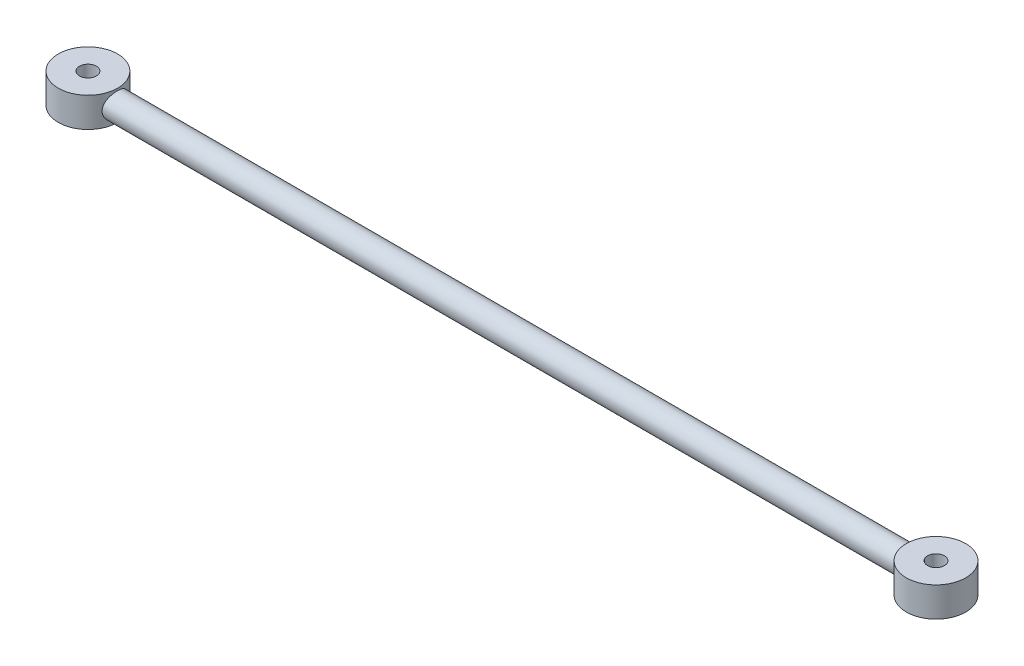
ISO-10303-21;
HEADER;
FILE_DESCRIPTION(('STEP AP214'),'2;1');
FILE_NAME('part.step','',(''),(''),'','','');
FILE_SCHEMA(('AUTOMOTIVE_DESIGN { 1 0 10303 214 1 1 1 1 }'));
ENDSEC;
DATA;
#1=APPLICATION_CONTEXT('core data for automotive mechanical design processes');
#2=APPLICATION_PROTOCOL_DEFINITION('international standard','automotive_design',2000,#1);
#3=PRODUCT_CONTEXT('',#1,'mechanical');
#4=PRODUCT('Part','Part','',(#3));
#5=PRODUCT_RELATED_PRODUCT_CATEGORY('part','',(#4));
#6=PRODUCT_DEFINITION_FORMATION('','',#4);
#7=PRODUCT_DEFINITION_CONTEXT('part definition',#1,'design');
#8=PRODUCT_DEFINITION('design','',#6,#7);
#9=PRODUCT_DEFINITION_SHAPE('','',#8);
#10=(LENGTH_UNIT() NAMED_UNIT(*) SI_UNIT(.MILLI.,.METRE.));
#11=(NAMED_UNIT(*) PLANE_ANGLE_UNIT() SI_UNIT($,.RADIAN.));
#12=(NAMED_UNIT(*) SI_UNIT($,.STERADIAN.) SOLID_ANGLE_UNIT());
#13=UNCERTAINTY_MEASURE_WITH_UNIT(LENGTH_MEASURE(1.E-05),#10,'distance_accuracy_value','');
#14=(GEOMETRIC_REPRESENTATION_CONTEXT(3) GLOBAL_UNCERTAINTY_ASSIGNED_CONTEXT((#13)) GLOBAL_UNIT_ASSIGNED_CONTEXT((#10,
#11,#12)) REPRESENTATION_CONTEXT('',''));
#15=CARTESIAN_POINT('',(0.,0.,0.));
#16=DIRECTION('',(0.,0.,1.));
#17=DIRECTION('',(1.,0.,0.));
#18=AXIS2_PLACEMENT_3D('',#15,#16,#17);
#19=CARTESIAN_POINT('',(0.,7.,0.));
#20=DIRECTION('',(0.,-1.,0.));
#21=DIRECTION('',(0.,0.,-1.));
#22=AXIS2_PLACEMENT_3D('',#19,#20,#21);
#23=CYLINDRICAL_SURFACE('',#22,7.);
#24=CARTESIAN_POINT('',(0.,7.,0.));
#25=DIRECTION('',(0.,1.,0.));
#26=DIRECTION('',(0.,0.,1.));
#27=AXIS2_PLACEMENT_3D('',#24,#25,#26);
#28=CIRCLE('',#27,7.);
#29=CARTESIAN_POINT('',(0.,7.,7.));
#30=VERTEX_POINT('',#29);
#31=EDGE_CURVE('E42',#30,#30,#28,.T.);
#32=ORIENTED_EDGE('',*,*,#31,.F.);
#33=EDGE_LOOP('',(#32));
#34=FACE_BOUND('',#33,.T.);
#35=CARTESIAN_POINT('',(0.,0.,0.));
#36=DIRECTION('',(0.,1.,0.));
#37=DIRECTION('',(0.,0.,1.));
#38=AXIS2_PLACEMENT_3D('',#35,#36,#37);
#39=CIRCLE('',#38,7.);
#40=CARTESIAN_POINT('',(0.,0.,7.));
#41=VERTEX_POINT('',#40);
#42=EDGE_CURVE('E46',#41,#41,#39,.T.);
#43=ORIENTED_EDGE('',*,*,#42,.T.);
#44=EDGE_LOOP('',(#43));
#45=FACE_BOUND('',#44,.T.);
#46=CARTESIAN_POINT('',(6.32455532033676,3.5,3.));
#47=CARTESIAN_POINT('',(6.32455623917925,3.42019923696911,2.99999904512121));
#48=CARTESIAN_POINT('',(6.32607259589376,3.34036918002945,2.99680914186365));
#49=CARTESIAN_POINT('',(6.33207844610818,3.18131310904515,2.98409481890062));
#50=CARTESIAN_POINT('',(6.33656983318198,3.10208751223992,2.97456636476115));
#51=CARTESIAN_POINT('',(6.35433138320313,2.86591097345671,2.93654933365817));
#52=CARTESIAN_POINT('',(6.3718883479981,2.71068003414275,2.8986294210123));
#53=CARTESIAN_POINT('',(6.41604959211165,2.41012968440135,2.79949691759116));
#54=CARTESIAN_POINT('',(6.44261548670749,2.2647713124138,2.73838302089271));
#55=CARTESIAN_POINT('',(6.50173461776113,1.98637445600225,2.59488993442856));
#56=CARTESIAN_POINT('',(6.53428667863442,1.8533335603279,2.51251491871712));
#57=CARTESIAN_POINT('',(6.604111083221,1.59454716049575,2.32303426891366));
#58=CARTESIAN_POINT('',(6.64154929418065,1.46971373094871,2.21474428773221));
#59=CARTESIAN_POINT('',(6.71556787556132,1.23929814294093,1.9789916252315));
#60=CARTESIAN_POINT('',(6.75214789882674,1.13372366200242,1.85152133453084));
#61=CARTESIAN_POINT('',(6.82236442416004,0.940080759541392,1.5737748906695));
#62=CARTESIAN_POINT('',(6.85578586283844,0.853050747922684,1.42271545416052));
#63=CARTESIAN_POINT('',(6.91387422205065,0.706035833355378,1.10640716164424));
#64=CARTESIAN_POINT('',(6.93854524147057,0.646038264254936,0.941164994307303));
#65=CARTESIAN_POINT('',(6.97517471062289,0.558134963639046,0.610764262051987));
#66=CARTESIAN_POINT('',(6.98775448299434,0.5286539309609,0.446095117735235));
#67=CARTESIAN_POINT('',(7.00104925914407,0.497517303282849,0.113699399968668));
#68=CARTESIAN_POINT('',(7.00176937203861,0.495849726301001,-0.0540258257506384));
#69=CARTESIAN_POINT('',(6.99162033228837,0.519590247791058,-0.376268415183327));
#70=CARTESIAN_POINT('',(6.98149359551672,0.543263799683697,-0.530941438169347));
#71=CARTESIAN_POINT('',(6.95182205628876,0.614024068920169,-0.833871717827574));
#72=CARTESIAN_POINT('',(6.93227655784003,0.661112516498579,-0.982128499493937));
#73=CARTESIAN_POINT('',(6.88526693329208,0.77790658965267,-1.27075797068383));
#74=CARTESIAN_POINT('',(6.85768620781763,0.847947292329128,-1.41097529460904));
#75=CARTESIAN_POINT('',(6.79727675004241,1.0083173553763,-1.67803533028446));
#76=CARTESIAN_POINT('',(6.76444613359548,1.09865400454071,-1.8048732130277));
#77=CARTESIAN_POINT('',(6.69393790301249,1.30480950667601,-2.05154784007323));
#78=CARTESIAN_POINT('',(6.65608139107459,1.42201886977399,-2.1701729768624));
#79=CARTESIAN_POINT('',(6.58157631342609,1.67470283164954,-2.38662617777592));
#80=CARTESIAN_POINT('',(6.5449282748833,1.81018527380674,-2.48444526456874));
#81=CARTESIAN_POINT('',(6.47566835431168,2.10177987447147,-2.65987942757701));
#82=CARTESIAN_POINT('',(6.44325238173047,2.25846414548125,-2.73662769389096));
#83=CARTESIAN_POINT('',(6.3884939447888,2.58428900834334,-2.86214771894642));
#84=CARTESIAN_POINT('',(6.36614379619967,2.75341998325804,-2.9109408263676));
#85=CARTESIAN_POINT('',(6.33598550498636,3.08717279561205,-2.9759867011968));
#86=CARTESIAN_POINT('',(6.32729797712828,3.25132898060731,-2.99421280080632));
#87=CARTESIAN_POINT('',(6.32292988606605,3.58054897510828,-3.00343131976712));
#88=CARTESIAN_POINT('',(6.32724437007431,3.74561241510746,-2.99443410914468));
#89=CARTESIAN_POINT('',(6.34748143158175,4.05986257374344,-2.9512647841786));
#90=CARTESIAN_POINT('',(6.36257694871081,4.20935574037177,-2.9188846108295));
#91=CARTESIAN_POINT('',(6.40159573000742,4.50064547636968,-2.83228012727602));
#92=CARTESIAN_POINT('',(6.42552113853308,4.64244016654448,-2.77805051059372));
#93=CARTESIAN_POINT('',(6.48076667248579,4.92120989029112,-2.64668378105435));
#94=CARTESIAN_POINT('',(6.51236308247384,5.05770732182204,-2.5686531941561));
#95=CARTESIAN_POINT('',(6.57901833984006,5.31635070551129,-2.39277124314047));
#96=CARTESIAN_POINT('',(6.61407874120977,5.43849016219808,-2.29491096228641));
#97=CARTESIAN_POINT('',(6.68739396565838,5.6760289255727,-2.07211495440809));
#98=CARTESIAN_POINT('',(6.72566111015056,5.78991523722376,-1.94556360485738));
#99=CARTESIAN_POINT('',(6.79826947497518,5.9951342372748,-1.67428466903032));
#100=CARTESIAN_POINT('',(6.83261030191759,6.08646466679208,-1.5295552644811));
#101=CARTESIAN_POINT('',(6.89381439172467,6.24408268980707,-1.2245807874168));
#102=CARTESIAN_POINT('',(6.92064008929576,6.3102450462872,-1.06426298143306));
#103=CARTESIAN_POINT('',(6.96347660484597,6.41414979815623,-0.733319762769437));
#104=CARTESIAN_POINT('',(6.9794942735468,6.45191019800838,-0.562700954301774));
#105=CARTESIAN_POINT('',(6.99808081286415,6.49557746015662,-0.22948038459567));
#106=CARTESIAN_POINT('',(7.00154837158207,6.50361382051941,-0.0672060876467148));
#107=CARTESIAN_POINT('',(6.99717401704727,6.49340448125966,0.256339620951763));
#108=CARTESIAN_POINT('',(6.98933429595527,6.47516387599597,0.41761122090852));
#109=CARTESIAN_POINT('',(6.96371224258031,6.41444649582745,0.728044798339694));
#110=CARTESIAN_POINT('',(6.9463310265813,6.37294615263452,0.877433690400419));
#111=CARTESIAN_POINT('',(6.90358200259661,6.26798381608021,1.16704890744754));
#112=CARTESIAN_POINT('',(6.87821272472253,6.20451778058432,1.30727354037359));
#113=CARTESIAN_POINT('',(6.82048100144583,6.05421011216401,1.58164154030708));
#114=CARTESIAN_POINT('',(6.78785230171247,5.96643407814648,1.71521554911027));
#115=CARTESIAN_POINT('',(6.71941601876114,5.7713182864619,1.96631980223032));
#116=CARTESIAN_POINT('',(6.68360718068102,5.66397078827051,2.08384366642576));
#117=CARTESIAN_POINT('',(6.60956029826528,5.42361613655686,2.30839582375668));
#118=CARTESIAN_POINT('',(6.57133471854879,5.28931158538104,2.41404185093548));
#119=CARTESIAN_POINT('',(6.49938146624856,5.0036538672722,2.60157161791914));
#120=CARTESIAN_POINT('',(6.46565641748318,4.85229084924017,2.68344152863089));
#121=CARTESIAN_POINT('',(6.42172587804179,4.61561755892372,2.78618250414778));
#122=CARTESIAN_POINT('',(6.40819457191417,4.53514424084097,2.81707998873811));
#123=CARTESIAN_POINT('',(6.38380411418013,4.37148377716792,2.87192428390112));
#124=CARTESIAN_POINT('',(6.37294364206054,4.28829799580876,2.89587453038153));
#125=CARTESIAN_POINT('',(6.35433014729515,4.12006919231867,2.93649221837599));
#126=CARTESIAN_POINT('',(6.3465689441917,4.03503169261803,2.9531788427136));
#127=CARTESIAN_POINT('',(6.33442493706763,3.86363722828714,2.97913893233313));
#128=CARTESIAN_POINT('',(6.33003954418514,3.77728132665879,2.9884180785096));
#129=CARTESIAN_POINT('',(6.32647229512562,3.65893859982364,2.99595579124565));
#130=CARTESIAN_POINT('',(6.32575401974705,3.62717571924005,2.99747183035651));
#131=CARTESIAN_POINT('',(6.3247953454093,3.56361011083144,2.99949413311609));
#132=CARTESIAN_POINT('',(6.32455495409998,3.5318073823767,3.00000038060031));
#133=CARTESIAN_POINT('',(6.32455532033676,3.5,3.));
#134=B_SPLINE_CURVE_WITH_KNOTS('',3,(#46,#47,#48,#49,#50,#51,#52,#53,#54,#55,#56,#57,#58,#59,
#60,#61,#62,#63,#64,#65,#66,#67,#68,#69,#70,#71,#72,#73,#74,#75,#76,#77,#78,#79,#80,#81,#82,#83,
#84,#85,#86,#87,#88,#89,#90,#91,#92,#93,#94,#95,#96,#97,#98,#99,#100,#101,#102,#103,#104,#105,
#106,#107,#108,#109,#110,#111,#112,#113,#114,#115,#116,#117,#118,#119,#120,#121,#122,#123,#124,
#125,#126,#127,#128,#129,#130,#131,#132,#133),.UNSPECIFIED.,.T.,.F.,(4,2,2,2,2,2,2,2,2,2,2,2,2,
2,2,2,2,2,2,2,2,2,2,2,2,2,2,2,2,2,2,2,2,2,2,2,2,2,2,2,2,2,2,4),(0.,0.239366653231037,
0.478885807272612,0.958574399125933,1.43624431857918,1.91382053150697,2.41995684393642,
2.92629448725105,3.45610451675016,3.98566604296334,4.48627308722847,4.98666446539179,
5.45487182502104,5.92311378779298,6.39852111765622,6.8740994521391,7.38485137094338,
7.89582322238327,8.42542768080316,8.95462715213609,9.44812252419892,9.94142993544506,
10.4004743903489,10.8596303986217,11.3387499488479,11.8180854227975,12.3391595177845,
12.8602857751477,13.3839722669446,13.9073265049035,14.3923682623503,14.8773159966024,
15.3432850585276,15.8093399138768,16.2966585998759,16.784170440423,17.3070906286303,
17.8303143607246,18.0917878499581,18.3531318004373,18.6137813055803,18.8742307225593,
18.9696371385413,19.0650450817536),.UNSPECIFIED.);
#135=CARTESIAN_POINT('',(6.32455532033676,3.5,3.));
#136=VERTEX_POINT('',#135);
#137=EDGE_CURVE('E10',#136,#136,#134,.T.);
#138=ORIENTED_EDGE('',*,*,#137,.F.);
#139=EDGE_LOOP('',(#138));
#140=FACE_BOUND('',#139,.T.);
#141=ADVANCED_FACE('F31',(#34,#45,#140),#23,.T.);
#142=CARTESIAN_POINT('',(0.,7.,0.));
#143=DIRECTION('',(0.,1.,0.));
#144=DIRECTION('',(0.,0.,1.));
#145=AXIS2_PLACEMENT_3D('',#142,#143,#144);
#146=PLANE('',#145);
#147=ORIENTED_EDGE('',*,*,#31,.T.);
#148=EDGE_LOOP('',(#147));
#149=FACE_BOUND('',#148,.T.);
#150=CARTESIAN_POINT('',(0.,7.,0.));
#151=DIRECTION('',(0.,1.,0.));
#152=DIRECTION('',(0.,0.,1.));
#153=AXIS2_PLACEMENT_3D('',#150,#151,#152);
#154=CIRCLE('',#153,2.);
#155=CARTESIAN_POINT('',(0.,7.,2.));
#156=VERTEX_POINT('',#155);
#157=EDGE_CURVE('E51',#156,#156,#154,.T.);
#158=ORIENTED_EDGE('',*,*,#157,.F.);
#159=EDGE_LOOP('',(#158));
#160=FACE_BOUND('',#159,.T.);
#161=ADVANCED_FACE('F93',(#149,#160),#146,.T.);
#162=CARTESIAN_POINT('',(0.,0.,0.));
#163=DIRECTION('',(0.,1.,0.));
#164=DIRECTION('',(0.,0.,1.));
#165=AXIS2_PLACEMENT_3D('',#162,#163,#164);
#166=PLANE('',#165);
#167=ORIENTED_EDGE('',*,*,#42,.F.);
#168=EDGE_LOOP('',(#167));
#169=FACE_BOUND('',#168,.T.);
#170=CARTESIAN_POINT('',(0.,0.,0.));
#171=DIRECTION('',(0.,1.,0.));
#172=DIRECTION('',(0.,0.,1.));
#173=AXIS2_PLACEMENT_3D('',#170,#171,#172);
#174=CIRCLE('',#173,2.);
#175=CARTESIAN_POINT('',(0.,0.,2.));
#176=VERTEX_POINT('',#175);
#177=EDGE_CURVE('E53',#176,#176,#174,.T.);
#178=ORIENTED_EDGE('',*,*,#177,.T.);
#179=EDGE_LOOP('',(#178));
#180=FACE_BOUND('',#179,.T.);
#181=ADVANCED_FACE('F98',(#169,#180),#166,.F.);
#182=CARTESIAN_POINT('',(0.,7.,0.));
#183=DIRECTION('',(0.,-1.,0.));
#184=DIRECTION('',(0.,0.,-1.));
#185=AXIS2_PLACEMENT_3D('',#182,#183,#184);
#186=CYLINDRICAL_SURFACE('',#185,2.);
#187=ORIENTED_EDGE('',*,*,#157,.T.);
#188=EDGE_LOOP('',(#187));
#189=FACE_BOUND('',#188,.T.);
#190=ORIENTED_EDGE('',*,*,#177,.F.);
#191=EDGE_LOOP('',(#190));
#192=FACE_BOUND('',#191,.T.);
#193=ADVANCED_FACE('F106',(#189,#192),#186,.F.);
#194=CARTESIAN_POINT('',(207.001,3.5,0.));
#195=DIRECTION('',(-1.,0.,0.));
#196=DIRECTION('',(0.,0.,1.));
#197=AXIS2_PLACEMENT_3D('',#194,#195,#196);
#198=CYLINDRICAL_SURFACE('',#197,3.);
#199=CARTESIAN_POINT('',(193.675444679663,3.5,3.));
#200=CARTESIAN_POINT('',(193.675443760821,3.42019923696911,2.99999904512121));
#201=CARTESIAN_POINT('',(193.673927404106,3.34036918002945,2.99680914186365));
#202=CARTESIAN_POINT('',(193.667921553892,3.18131310904515,2.98409481890062));
#203=CARTESIAN_POINT('',(193.663430166818,3.10208751223992,2.97456636476115));
#204=CARTESIAN_POINT('',(193.645668616797,2.86591097345671,2.93654933365817));
#205=CARTESIAN_POINT('',(193.628111652002,2.71068003414276,2.8986294210123));
#206=CARTESIAN_POINT('',(193.583950407888,2.41012968440135,2.79949691759116));
#207=CARTESIAN_POINT('',(193.557384513293,2.2647713124138,2.73838302089271));
#208=CARTESIAN_POINT('',(193.498265382239,1.98637445600225,2.59488993442855));
#209=CARTESIAN_POINT('',(193.465713321366,1.8533335603279,2.51251491871712));
#210=CARTESIAN_POINT('',(193.395888916779,1.59454716049575,2.32303426891366));
#211=CARTESIAN_POINT('',(193.358450705819,1.46971373094871,2.21474428773221));
#212=CARTESIAN_POINT('',(193.284432124439,1.23929814294094,1.97899162523151));
#213=CARTESIAN_POINT('',(193.247852101173,1.13372366200242,1.85152133453084));
#214=CARTESIAN_POINT('',(193.17763557584,0.940080759541396,1.57377489066951));
#215=CARTESIAN_POINT('',(193.144214137162,0.853050747922688,1.42271545416053));
#216=CARTESIAN_POINT('',(193.086125777949,0.706035833355381,1.10640716164425));
#217=CARTESIAN_POINT('',(193.061454758529,0.646038264254939,0.94116499430731));
#218=CARTESIAN_POINT('',(193.024825289377,0.558134963639048,0.610764262051994));
#219=CARTESIAN_POINT('',(193.012245517006,0.5286539309609,0.446095117735242));
#220=CARTESIAN_POINT('',(192.998950740856,0.497517303282848,0.113699399968674));
#221=CARTESIAN_POINT('',(192.998230627961,0.495849726301001,-0.0540258257506322));
#222=CARTESIAN_POINT('',(193.008379667712,0.519590247791057,-0.376268415183323));
#223=CARTESIAN_POINT('',(193.018506404483,0.543263799683697,-0.530941438169344));
#224=CARTESIAN_POINT('',(193.048177943711,0.614024068920168,-0.833871717827571));
#225=CARTESIAN_POINT('',(193.06772344216,0.661112516498578,-0.982128499493933));
#226=CARTESIAN_POINT('',(193.114733066708,0.777906589652669,-1.27075797068383));
#227=CARTESIAN_POINT('',(193.142313792182,0.847947292329127,-1.41097529460903));
#228=CARTESIAN_POINT('',(193.202723249958,1.0083173553763,-1.67803533028446));
#229=CARTESIAN_POINT('',(193.235553866405,1.09865400454071,-1.8048732130277));
#230=CARTESIAN_POINT('',(193.306062096988,1.30480950667601,-2.05154784007322));
#231=CARTESIAN_POINT('',(193.343918608925,1.42201886977399,-2.1701729768624));
#232=CARTESIAN_POINT('',(193.418423686574,1.67470283164954,-2.38662617777592));
#233=CARTESIAN_POINT('',(193.455071725117,1.81018527380674,-2.48444526456874));
#234=CARTESIAN_POINT('',(193.524331645688,2.10177987447147,-2.65987942757701));
#235=CARTESIAN_POINT('',(193.55674761827,2.25846414548125,-2.73662769389097));
#236=CARTESIAN_POINT('',(193.611506055211,2.58428900834334,-2.86214771894642));
#237=CARTESIAN_POINT('',(193.6338562038,2.75341998325804,-2.9109408263676));
#238=CARTESIAN_POINT('',(193.664014495014,3.08717279561205,-2.9759867011968));
#239=CARTESIAN_POINT('',(193.672702022872,3.25132898060731,-2.99421280080632));
#240=CARTESIAN_POINT('',(193.677070113934,3.58054897510828,-3.00343131976712));
#241=CARTESIAN_POINT('',(193.672755629926,3.74561241510746,-2.99443410914468));
#242=CARTESIAN_POINT('',(193.652518568418,4.05986257374344,-2.9512647841786));
#243=CARTESIAN_POINT('',(193.637423051289,4.20935574037177,-2.9188846108295));
#244=CARTESIAN_POINT('',(193.598404269993,4.50064547636967,-2.83228012727603));
#245=CARTESIAN_POINT('',(193.574478861467,4.64244016654448,-2.77805051059372));
#246=CARTESIAN_POINT('',(193.519233327514,4.92120989029112,-2.64668378105435));
#247=CARTESIAN_POINT('',(193.487636917526,5.05770732182203,-2.5686531941561));
#248=CARTESIAN_POINT('',(193.42098166016,5.31635070551129,-2.39277124314048));
#249=CARTESIAN_POINT('',(193.38592125879,5.43849016219807,-2.29491096228642));
#250=CARTESIAN_POINT('',(193.312606034342,5.6760289255727,-2.07211495440809));
#251=CARTESIAN_POINT('',(193.274338889849,5.78991523722375,-1.94556360485739));
#252=CARTESIAN_POINT('',(193.201730525025,5.9951342372748,-1.67428466903032));
#253=CARTESIAN_POINT('',(193.167389698082,6.08646466679207,-1.5295552644811));
#254=CARTESIAN_POINT('',(193.106185608275,6.24408268980707,-1.2245807874168));
#255=CARTESIAN_POINT('',(193.079359910704,6.3102450462872,-1.06426298143306));
#256=CARTESIAN_POINT('',(193.036523395154,6.41414979815623,-0.733319762769436));
#257=CARTESIAN_POINT('',(193.020505726453,6.45191019800838,-0.562700954301774));
#258=CARTESIAN_POINT('',(193.001919187136,6.49557746015662,-0.22948038459567));
#259=CARTESIAN_POINT('',(192.998451628418,6.50361382051941,-0.0672060876467145));
#260=CARTESIAN_POINT('',(193.002825982953,6.49340448125966,0.256339620951763));
#261=CARTESIAN_POINT('',(193.010665704045,6.47516387599597,0.417611220908519));
#262=CARTESIAN_POINT('',(193.03628775742,6.41444649582745,0.728044798339692));
#263=CARTESIAN_POINT('',(193.053668973419,6.37294615263452,0.877433690400416));
#264=CARTESIAN_POINT('',(193.096417997403,6.26798381608021,1.16704890744753));
#265=CARTESIAN_POINT('',(193.121787275278,6.20451778058433,1.30727354037359));
#266=CARTESIAN_POINT('',(193.179518998554,6.05421011216401,1.58164154030708));
#267=CARTESIAN_POINT('',(193.212147698288,5.96643407814648,1.71521554911027));
#268=CARTESIAN_POINT('',(193.280583981239,5.7713182864619,1.96631980223032));
#269=CARTESIAN_POINT('',(193.316392819319,5.66397078827052,2.08384366642575));
#270=CARTESIAN_POINT('',(193.390439701735,5.42361613655686,2.30839582375667));
#271=CARTESIAN_POINT('',(193.428665281451,5.28931158538105,2.41404185093547));
#272=CARTESIAN_POINT('',(193.500618533751,5.0036538672722,2.60157161791914));
#273=CARTESIAN_POINT('',(193.534343582517,4.85229084924018,2.68344152863089));
#274=CARTESIAN_POINT('',(193.578274121958,4.61561755892372,2.78618250414778));
#275=CARTESIAN_POINT('',(193.591805428086,4.53514424084098,2.81707998873811));
#276=CARTESIAN_POINT('',(193.61619588582,4.37148377716792,2.87192428390112));
#277=CARTESIAN_POINT('',(193.627056357939,4.28829799580877,2.89587453038153));
#278=CARTESIAN_POINT('',(193.645669852705,4.12006919231868,2.93649221837599));
#279=CARTESIAN_POINT('',(193.653431055808,4.03503169261803,2.9531788427136));
#280=CARTESIAN_POINT('',(193.665575062932,3.86363722828715,2.97913893233313));
#281=CARTESIAN_POINT('',(193.669960455815,3.77728132665879,2.9884180785096));
#282=CARTESIAN_POINT('',(193.673527704874,3.65893859982364,2.99595579124565));
#283=CARTESIAN_POINT('',(193.674245980253,3.62717571924005,2.99747183035651));
#284=CARTESIAN_POINT('',(193.675204654591,3.56361011083144,2.99949413311609));
#285=CARTESIAN_POINT('',(193.6754450459,3.5318073823767,3.00000038060031));
#286=CARTESIAN_POINT('',(193.675444679663,3.5,3.));
#287=B_SPLINE_CURVE_WITH_KNOTS('',3,(#199,#200,#201,#202,#203,#204,#205,#206,#207,#208,#209,
#210,#211,#212,#213,#214,#215,#216,#217,#218,#219,#220,#221,#222,#223,#224,#225,#226,#227,#228,
#229,#230,#231,#232,#233,#234,#235,#236,#237,#238,#239,#240,#241,#242,#243,#244,#245,#246,#247,
#248,#249,#250,#251,#252,#253,#254,#255,#256,#257,#258,#259,#260,#261,#262,#263,#264,#265,#266,
#267,#268,#269,#270,#271,#272,#273,#274,#275,#276,#277,#278,#279,#280,#281,#282,#283,#284,#285,
#286),.UNSPECIFIED.,.T.,.F.,(4,2,2,2,2,2,2,2,2,2,2,2,2,2,2,2,2,2,2,2,2,2,2,2,2,2,2,2,2,2,2,2,2,
2,2,2,2,2,2,2,2,2,2,4),(0.,0.239366653231036,0.47888580727261,0.958574399125931,
1.43624431857919,1.91382053150697,2.41995684393642,2.92629448725105,3.45610451675015,
3.98566604296333,4.48627308722846,4.98666446539178,5.45487182502104,5.92311378779297,
6.39852111765622,6.87409945213909,7.38485137094338,7.89582322238327,8.42542768080316,
8.95462715213609,9.44812252419892,9.94142993544506,10.4004743903489,10.8596303986217,
11.3387499488479,11.8180854227975,12.3391595177845,12.8602857751477,13.3839722669447,
13.9073265049036,14.3923682623503,14.8773159966024,15.3432850585276,15.8093399138768,
16.2966585998759,16.784170440423,17.3070906286303,17.8303143607246,18.0917878499581,
18.3531318004373,18.6137813055803,18.8742307225593,18.9696371385413,19.0650450817536),.UNSPECIFIED.);
#288=CARTESIAN_POINT('',(193.675444679663,3.5,3.));
#289=VERTEX_POINT('',#288);
#290=EDGE_CURVE('E56',#289,#289,#287,.T.);
#291=ORIENTED_EDGE('',*,*,#290,.F.);
#292=EDGE_LOOP('',(#291));
#293=FACE_BOUND('',#292,.T.);
#294=ORIENTED_EDGE('',*,*,#137,.T.);
#295=EDGE_LOOP('',(#294));
#296=FACE_BOUND('',#295,.T.);
#297=ADVANCED_FACE('F68',(#293,#296),#198,.T.);
#298=CARTESIAN_POINT('',(200.,7.,0.));
#299=DIRECTION('',(0.,-1.,0.));
#300=DIRECTION('',(0.,0.,-1.));
#301=AXIS2_PLACEMENT_3D('',#298,#299,#300);
#302=CYLINDRICAL_SURFACE('',#301,6.99999999999998);
#303=CARTESIAN_POINT('',(200.,0.,0.));
#304=DIRECTION('',(0.,1.,0.));
#305=DIRECTION('',(0.,0.,1.));
#306=AXIS2_PLACEMENT_3D('',#303,#304,#305);
#307=CIRCLE('',#306,6.99999999999998);
#308=CARTESIAN_POINT('',(200.,0.,6.99999999999998));
#309=VERTEX_POINT('',#308);
#310=EDGE_CURVE('E66',#309,#309,#307,.T.);
#311=ORIENTED_EDGE('',*,*,#310,.T.);
#312=EDGE_LOOP('',(#311));
#313=FACE_BOUND('',#312,.T.);
#314=CARTESIAN_POINT('',(200.,7.,0.));
#315=DIRECTION('',(0.,1.,0.));
#316=DIRECTION('',(0.,0.,1.));
#317=AXIS2_PLACEMENT_3D('',#314,#315,#316);
#318=CIRCLE('',#317,6.99999999999998);
#319=CARTESIAN_POINT('',(200.,7.,6.99999999999998));
#320=VERTEX_POINT('',#319);
#321=EDGE_CURVE('E65',#320,#320,#318,.T.);
#322=ORIENTED_EDGE('',*,*,#321,.F.);
#323=EDGE_LOOP('',(#322));
#324=FACE_BOUND('',#323,.T.);
#325=ORIENTED_EDGE('',*,*,#290,.T.);
#326=EDGE_LOOP('',(#325));
#327=FACE_BOUND('',#326,.T.);
#328=ADVANCED_FACE('F73',(#313,#324,#327),#302,.T.);
#329=CARTESIAN_POINT('',(200.,7.,0.));
#330=DIRECTION('',(0.,1.,0.));
#331=DIRECTION('',(0.,0.,1.));
#332=AXIS2_PLACEMENT_3D('',#329,#330,#331);
#333=PLANE('',#332);
#334=ORIENTED_EDGE('',*,*,#321,.T.);
#335=EDGE_LOOP('',(#334));
#336=FACE_BOUND('',#335,.T.);
#337=CARTESIAN_POINT('',(200.,7.,0.));
#338=DIRECTION('',(0.,1.,0.));
#339=DIRECTION('',(0.,0.,1.));
#340=AXIS2_PLACEMENT_3D('',#337,#338,#339);
#341=CIRCLE('',#340,2.);
#342=CARTESIAN_POINT('',(200.,7.,2.));
#343=VERTEX_POINT('',#342);
#344=EDGE_CURVE('E168',#343,#343,#341,.T.);
#345=ORIENTED_EDGE('',*,*,#344,.F.);
#346=EDGE_LOOP('',(#345));
#347=FACE_BOUND('',#346,.T.);
#348=ADVANCED_FACE('F76',(#336,#347),#333,.T.);
#349=CARTESIAN_POINT('',(200.,0.,0.));
#350=DIRECTION('',(0.,1.,0.));
#351=DIRECTION('',(0.,0.,1.));
#352=AXIS2_PLACEMENT_3D('',#349,#350,#351);
#353=PLANE('',#352);
#354=ORIENTED_EDGE('',*,*,#310,.F.);
#355=EDGE_LOOP('',(#354));
#356=FACE_BOUND('',#355,.T.);
#357=CARTESIAN_POINT('',(200.,0.,0.));
#358=DIRECTION('',(0.,1.,0.));
#359=DIRECTION('',(0.,0.,1.));
#360=AXIS2_PLACEMENT_3D('',#357,#358,#359);
#361=CIRCLE('',#360,2.);
#362=CARTESIAN_POINT('',(200.,0.,2.));
#363=VERTEX_POINT('',#362);
#364=EDGE_CURVE('E171',#363,#363,#361,.T.);
#365=ORIENTED_EDGE('',*,*,#364,.T.);
#366=EDGE_LOOP('',(#365));
#367=FACE_BOUND('',#366,.T.);
#368=ADVANCED_FACE('F78',(#356,#367),#353,.F.);
#369=CARTESIAN_POINT('',(200.,7.,0.));
#370=DIRECTION('',(0.,-1.,0.));
#371=DIRECTION('',(0.,0.,-1.));
#372=AXIS2_PLACEMENT_3D('',#369,#370,#371);
#373=CYLINDRICAL_SURFACE('',#372,2.);
#374=ORIENTED_EDGE('',*,*,#344,.T.);
#375=EDGE_LOOP('',(#374));
#376=FACE_BOUND('',#375,.T.);
#377=ORIENTED_EDGE('',*,*,#364,.F.);
#378=EDGE_LOOP('',(#377));
#379=FACE_BOUND('',#378,.T.);
#380=ADVANCED_FACE('F81',(#376,#379),#373,.F.);
#381=CLOSED_SHELL('',(#141,#161,#181,#193,#297,#328,#348,#368,#380));
#382=MANIFOLD_SOLID_BREP('B2',#381);
#383=ADVANCED_BREP_SHAPE_REPRESENTATION('',(#18,#382),#14);
#384=SHAPE_DEFINITION_REPRESENTATION(#9,#383);
ENDSEC;
END-ISO-10303-21;
